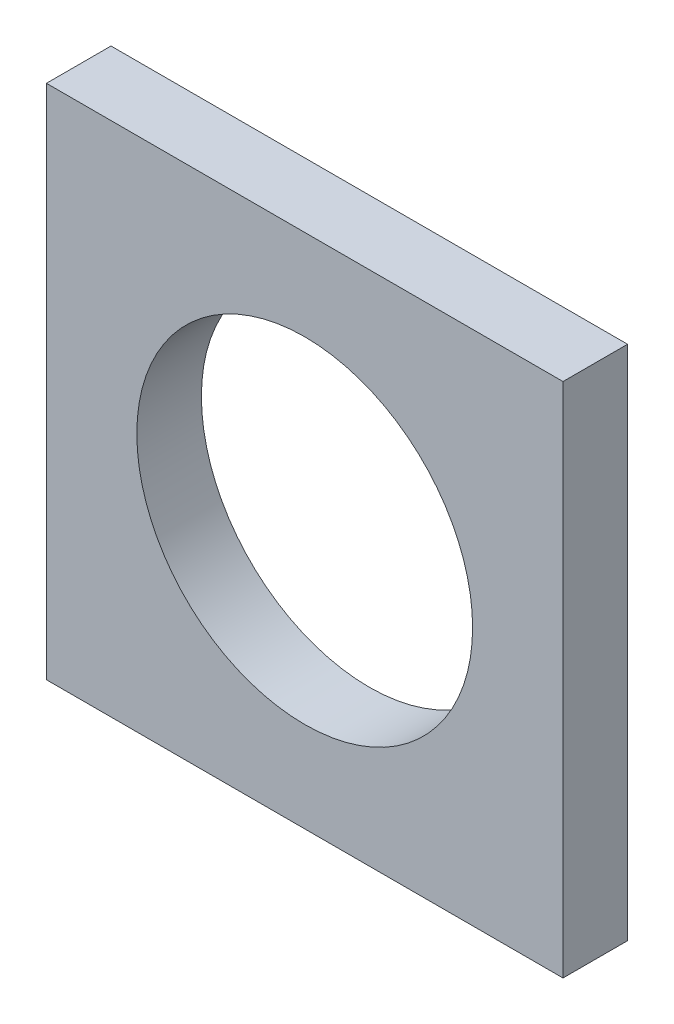
ISO-10303-21;
HEADER;
FILE_DESCRIPTION(('STEP AP214'),'2;1');
FILE_NAME('part.step','',(''),(''),'','','');
FILE_SCHEMA(('AUTOMOTIVE_DESIGN { 1 0 10303 214 1 1 1 1 }'));
ENDSEC;
DATA;
#1=APPLICATION_CONTEXT('core data for automotive mechanical design processes');
#2=APPLICATION_PROTOCOL_DEFINITION('international standard','automotive_design',2000,#1);
#3=PRODUCT_CONTEXT('',#1,'mechanical');
#4=PRODUCT('Part','Part','',(#3));
#5=PRODUCT_RELATED_PRODUCT_CATEGORY('part','',(#4));
#6=PRODUCT_DEFINITION_FORMATION('','',#4);
#7=PRODUCT_DEFINITION_CONTEXT('part definition',#1,'design');
#8=PRODUCT_DEFINITION('design','',#6,#7);
#9=PRODUCT_DEFINITION_SHAPE('','',#8);
#10=(LENGTH_UNIT() NAMED_UNIT(*) SI_UNIT(.MILLI.,.METRE.));
#11=(NAMED_UNIT(*) PLANE_ANGLE_UNIT() SI_UNIT($,.RADIAN.));
#12=(NAMED_UNIT(*) SI_UNIT($,.STERADIAN.) SOLID_ANGLE_UNIT());
#13=UNCERTAINTY_MEASURE_WITH_UNIT(LENGTH_MEASURE(1.E-05),#10,'distance_accuracy_value','');
#14=(GEOMETRIC_REPRESENTATION_CONTEXT(3) GLOBAL_UNCERTAINTY_ASSIGNED_CONTEXT((#13)) GLOBAL_UNIT_ASSIGNED_CONTEXT((#10,
#11,#12)) REPRESENTATION_CONTEXT('',''));
#15=CARTESIAN_POINT('',(0.,0.,0.));
#16=DIRECTION('',(0.,0.,1.));
#17=DIRECTION('',(1.,0.,0.));
#18=AXIS2_PLACEMENT_3D('',#15,#16,#17);
#19=CARTESIAN_POINT('',(0.,0.,2.5));
#20=DIRECTION('',(0.,0.,-1.));
#21=DIRECTION('',(-1.,0.,0.));
#22=AXIS2_PLACEMENT_3D('',#19,#20,#21);
#23=PLANE('',#22);
#24=DIRECTION('',(0.,1.,0.));
#25=VECTOR('',#24,1.);
#26=CARTESIAN_POINT('',(10.,-10.,2.5));
#27=LINE('',#26,#25);
#28=CARTESIAN_POINT('',(10.,-10.,2.5));
#29=VERTEX_POINT('',#28);
#30=CARTESIAN_POINT('',(10.,10.,2.5));
#31=VERTEX_POINT('',#30);
#32=EDGE_CURVE('E92',#29,#31,#27,.T.);
#33=ORIENTED_EDGE('',*,*,#32,.T.);
#34=DIRECTION('',(-1.,0.,0.));
#35=VECTOR('',#34,1.);
#36=CARTESIAN_POINT('',(-10.,10.,2.5));
#37=LINE('',#36,#35);
#38=CARTESIAN_POINT('',(-10.,10.,2.5));
#39=VERTEX_POINT('',#38);
#40=EDGE_CURVE('E87',#31,#39,#37,.T.);
#41=ORIENTED_EDGE('',*,*,#40,.T.);
#42=DIRECTION('',(0.,-1.,0.));
#43=VECTOR('',#42,1.);
#44=CARTESIAN_POINT('',(-10.,-10.,2.5));
#45=LINE('',#44,#43);
#46=CARTESIAN_POINT('',(-10.,-10.,2.5));
#47=VERTEX_POINT('',#46);
#48=EDGE_CURVE('E90',#39,#47,#45,.T.);
#49=ORIENTED_EDGE('',*,*,#48,.T.);
#50=DIRECTION('',(1.,0.,0.));
#51=VECTOR('',#50,1.);
#52=CARTESIAN_POINT('',(-10.,-10.,2.5));
#53=LINE('',#52,#51);
#54=EDGE_CURVE('E57',#47,#29,#53,.T.);
#55=ORIENTED_EDGE('',*,*,#54,.T.);
#56=EDGE_LOOP('',(#33,#41,#49,#55));
#57=FACE_BOUND('',#56,.T.);
#58=CARTESIAN_POINT('',(0.,0.,2.5));
#59=DIRECTION('',(0.,0.,1.));
#60=DIRECTION('',(1.,0.,0.));
#61=AXIS2_PLACEMENT_3D('',#58,#59,#60);
#62=CIRCLE('',#61,6.5);
#63=CARTESIAN_POINT('',(6.5,0.,2.5));
#64=VERTEX_POINT('',#63);
#65=EDGE_CURVE('E112',#64,#64,#62,.T.);
#66=ORIENTED_EDGE('',*,*,#65,.F.);
#67=EDGE_LOOP('',(#66));
#68=FACE_BOUND('',#67,.T.);
#69=ADVANCED_FACE('F39',(#57,#68),#23,.F.);
#70=CARTESIAN_POINT('',(0.,0.,0.));
#71=DIRECTION('',(0.,0.,-1.));
#72=DIRECTION('',(-1.,0.,0.));
#73=AXIS2_PLACEMENT_3D('',#70,#71,#72);
#74=PLANE('',#73);
#75=DIRECTION('',(0.,1.,0.));
#76=VECTOR('',#75,1.);
#77=CARTESIAN_POINT('',(10.,-10.,0.));
#78=LINE('',#77,#76);
#79=CARTESIAN_POINT('',(10.,-10.,0.));
#80=VERTEX_POINT('',#79);
#81=CARTESIAN_POINT('',(10.,10.,0.));
#82=VERTEX_POINT('',#81);
#83=EDGE_CURVE('E108',#80,#82,#78,.T.);
#84=ORIENTED_EDGE('',*,*,#83,.F.);
#85=DIRECTION('',(1.,0.,0.));
#86=VECTOR('',#85,1.);
#87=CARTESIAN_POINT('',(-10.,-10.,0.));
#88=LINE('',#87,#86);
#89=CARTESIAN_POINT('',(-10.,-10.,0.));
#90=VERTEX_POINT('',#89);
#91=EDGE_CURVE('E80',#90,#80,#88,.T.);
#92=ORIENTED_EDGE('',*,*,#91,.F.);
#93=DIRECTION('',(0.,-1.,0.));
#94=VECTOR('',#93,1.);
#95=CARTESIAN_POINT('',(-10.,-10.,0.));
#96=LINE('',#95,#94);
#97=CARTESIAN_POINT('',(-10.,10.,0.));
#98=VERTEX_POINT('',#97);
#99=EDGE_CURVE('E74',#98,#90,#96,.T.);
#100=ORIENTED_EDGE('',*,*,#99,.F.);
#101=DIRECTION('',(-1.,0.,0.));
#102=VECTOR('',#101,1.);
#103=CARTESIAN_POINT('',(-10.,10.,0.));
#104=LINE('',#103,#102);
#105=EDGE_CURVE('E97',#82,#98,#104,.T.);
#106=ORIENTED_EDGE('',*,*,#105,.F.);
#107=EDGE_LOOP('',(#84,#92,#100,#106));
#108=FACE_BOUND('',#107,.T.);
#109=CARTESIAN_POINT('',(0.,0.,0.));
#110=DIRECTION('',(0.,0.,1.));
#111=DIRECTION('',(1.,0.,0.));
#112=AXIS2_PLACEMENT_3D('',#109,#110,#111);
#113=CIRCLE('',#112,6.5);
#114=CARTESIAN_POINT('',(6.5,0.,0.));
#115=VERTEX_POINT('',#114);
#116=EDGE_CURVE('E130',#115,#115,#113,.T.);
#117=ORIENTED_EDGE('',*,*,#116,.T.);
#118=EDGE_LOOP('',(#117));
#119=FACE_BOUND('',#118,.T.);
#120=ADVANCED_FACE('F125',(#108,#119),#74,.T.);
#121=CARTESIAN_POINT('',(10.,-10.,2.5));
#122=DIRECTION('',(-1.,0.,0.));
#123=DIRECTION('',(0.,0.,1.));
#124=AXIS2_PLACEMENT_3D('',#121,#122,#123);
#125=PLANE('',#124);
#126=ORIENTED_EDGE('',*,*,#83,.T.);
#127=DIRECTION('',(0.,0.,-1.));
#128=VECTOR('',#127,1.);
#129=CARTESIAN_POINT('',(10.,10.,2.5));
#130=LINE('',#129,#128);
#131=EDGE_CURVE('E11',#31,#82,#130,.T.);
#132=ORIENTED_EDGE('',*,*,#131,.F.);
#133=ORIENTED_EDGE('',*,*,#32,.F.);
#134=DIRECTION('',(0.,0.,-1.));
#135=VECTOR('',#134,1.);
#136=CARTESIAN_POINT('',(10.,-10.,2.5));
#137=LINE('',#136,#135);
#138=EDGE_CURVE('E104',#29,#80,#137,.T.);
#139=ORIENTED_EDGE('',*,*,#138,.T.);
#140=EDGE_LOOP('',(#126,#132,#133,#139));
#141=FACE_BOUND('',#140,.T.);
#142=ADVANCED_FACE('F41',(#141),#125,.F.);
#143=CARTESIAN_POINT('',(-10.,10.,2.5));
#144=DIRECTION('',(0.,-1.,0.));
#145=DIRECTION('',(0.,0.,-1.));
#146=AXIS2_PLACEMENT_3D('',#143,#144,#145);
#147=PLANE('',#146);
#148=ORIENTED_EDGE('',*,*,#105,.T.);
#149=DIRECTION('',(0.,0.,-1.));
#150=VECTOR('',#149,1.);
#151=CARTESIAN_POINT('',(-10.,10.,2.5));
#152=LINE('',#151,#150);
#153=EDGE_CURVE('E49',#39,#98,#152,.T.);
#154=ORIENTED_EDGE('',*,*,#153,.F.);
#155=ORIENTED_EDGE('',*,*,#40,.F.);
#156=ORIENTED_EDGE('',*,*,#131,.T.);
#157=EDGE_LOOP('',(#148,#154,#155,#156));
#158=FACE_BOUND('',#157,.T.);
#159=ADVANCED_FACE('F96',(#158),#147,.F.);
#160=CARTESIAN_POINT('',(-10.,-10.,2.5));
#161=DIRECTION('',(1.,0.,0.));
#162=DIRECTION('',(0.,0.,-1.));
#163=AXIS2_PLACEMENT_3D('',#160,#161,#162);
#164=PLANE('',#163);
#165=ORIENTED_EDGE('',*,*,#99,.T.);
#166=DIRECTION('',(0.,0.,-1.));
#167=VECTOR('',#166,1.);
#168=CARTESIAN_POINT('',(-10.,-10.,2.5));
#169=LINE('',#168,#167);
#170=EDGE_CURVE('E99',#47,#90,#169,.T.);
#171=ORIENTED_EDGE('',*,*,#170,.F.);
#172=ORIENTED_EDGE('',*,*,#48,.F.);
#173=ORIENTED_EDGE('',*,*,#153,.T.);
#174=EDGE_LOOP('',(#165,#171,#172,#173));
#175=FACE_BOUND('',#174,.T.);
#176=ADVANCED_FACE('F100',(#175),#164,.F.);
#177=CARTESIAN_POINT('',(-10.,-10.,2.5));
#178=DIRECTION('',(0.,1.,0.));
#179=DIRECTION('',(0.,0.,1.));
#180=AXIS2_PLACEMENT_3D('',#177,#178,#179);
#181=PLANE('',#180);
#182=ORIENTED_EDGE('',*,*,#91,.T.);
#183=ORIENTED_EDGE('',*,*,#138,.F.);
#184=ORIENTED_EDGE('',*,*,#54,.F.);
#185=ORIENTED_EDGE('',*,*,#170,.T.);
#186=EDGE_LOOP('',(#182,#183,#184,#185));
#187=FACE_BOUND('',#186,.T.);
#188=ADVANCED_FACE('F122',(#187),#181,.F.);
#189=CARTESIAN_POINT('',(0.,0.,2.5));
#190=DIRECTION('',(0.,0.,-1.));
#191=DIRECTION('',(-1.,0.,0.));
#192=AXIS2_PLACEMENT_3D('',#189,#190,#191);
#193=CYLINDRICAL_SURFACE('',#192,6.5);
#194=ORIENTED_EDGE('',*,*,#65,.T.);
#195=EDGE_LOOP('',(#194));
#196=FACE_BOUND('',#195,.T.);
#197=ORIENTED_EDGE('',*,*,#116,.F.);
#198=EDGE_LOOP('',(#197));
#199=FACE_BOUND('',#198,.T.);
#200=ADVANCED_FACE('F138',(#196,#199),#193,.F.);
#201=CLOSED_SHELL('',(#69,#120,#142,#159,#176,#188,#200));
#202=MANIFOLD_SOLID_BREP('B2',#201);
#203=ADVANCED_BREP_SHAPE_REPRESENTATION('',(#18,#202),#14);
#204=SHAPE_DEFINITION_REPRESENTATION(#9,#203);
ENDSEC;
END-ISO-10303-21;
